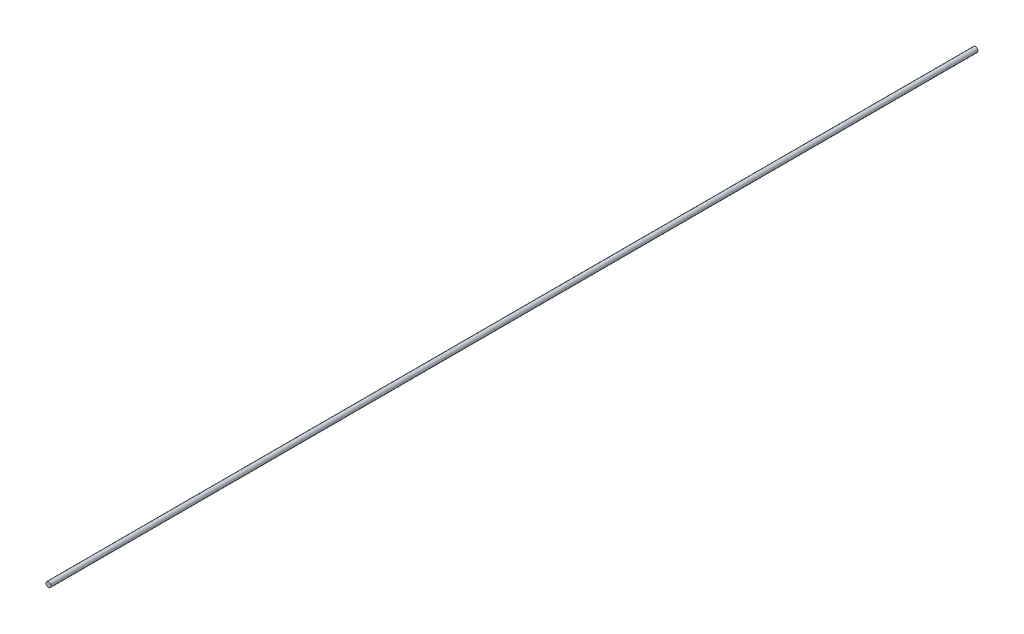
ISO-10303-21;
HEADER;
FILE_DESCRIPTION(('STEP AP214'),'2;1');
FILE_NAME('part.step','',(''),(''),'','','');
FILE_SCHEMA(('AUTOMOTIVE_DESIGN { 1 0 10303 214 1 1 1 1 }'));
ENDSEC;
DATA;
#1=APPLICATION_CONTEXT('core data for automotive mechanical design processes');
#2=APPLICATION_PROTOCOL_DEFINITION('international standard','automotive_design',2000,#1);
#3=PRODUCT_CONTEXT('',#1,'mechanical');
#4=PRODUCT('Part','Part','',(#3));
#5=PRODUCT_RELATED_PRODUCT_CATEGORY('part','',(#4));
#6=PRODUCT_DEFINITION_FORMATION('','',#4);
#7=PRODUCT_DEFINITION_CONTEXT('part definition',#1,'design');
#8=PRODUCT_DEFINITION('design','',#6,#7);
#9=PRODUCT_DEFINITION_SHAPE('','',#8);
#10=(LENGTH_UNIT() NAMED_UNIT(*) SI_UNIT(.MILLI.,.METRE.));
#11=(NAMED_UNIT(*) PLANE_ANGLE_UNIT() SI_UNIT($,.RADIAN.));
#12=(NAMED_UNIT(*) SI_UNIT($,.STERADIAN.) SOLID_ANGLE_UNIT());
#13=UNCERTAINTY_MEASURE_WITH_UNIT(LENGTH_MEASURE(1.E-05),#10,'distance_accuracy_value','');
#14=(GEOMETRIC_REPRESENTATION_CONTEXT(3) GLOBAL_UNCERTAINTY_ASSIGNED_CONTEXT((#13)) GLOBAL_UNIT_ASSIGNED_CONTEXT((#10,
#11,#12)) REPRESENTATION_CONTEXT('',''));
#15=CARTESIAN_POINT('',(0.,0.,0.));
#16=DIRECTION('',(0.,0.,1.));
#17=DIRECTION('',(1.,0.,0.));
#18=AXIS2_PLACEMENT_3D('',#15,#16,#17);
#19=CARTESIAN_POINT('',(0.,0.,4684.8900209175));
#20=DIRECTION('',(0.,0.,-1.));
#21=DIRECTION('',(-1.,0.,0.));
#22=AXIS2_PLACEMENT_3D('',#19,#20,#21);
#23=CYLINDRICAL_SURFACE('',#22,12.7);
#24=CARTESIAN_POINT('',(0.,0.,4684.8900209175));
#25=DIRECTION('',(0.,0.,1.));
#26=DIRECTION('',(1.,0.,0.));
#27=AXIS2_PLACEMENT_3D('',#24,#25,#26);
#28=CIRCLE('',#27,12.7);
#29=CARTESIAN_POINT('',(12.7,0.,4684.8900209175));
#30=VERTEX_POINT('',#29);
#31=EDGE_CURVE('E10',#30,#30,#28,.T.);
#32=ORIENTED_EDGE('',*,*,#31,.F.);
#33=EDGE_LOOP('',(#32));
#34=FACE_BOUND('',#33,.T.);
#35=CARTESIAN_POINT('',(0.,0.,0.));
#36=DIRECTION('',(0.,0.,1.));
#37=DIRECTION('',(1.,0.,0.));
#38=AXIS2_PLACEMENT_3D('',#35,#36,#37);
#39=CIRCLE('',#38,12.7);
#40=CARTESIAN_POINT('',(12.7,0.,0.));
#41=VERTEX_POINT('',#40);
#42=EDGE_CURVE('E45',#41,#41,#39,.T.);
#43=ORIENTED_EDGE('',*,*,#42,.T.);
#44=EDGE_LOOP('',(#43));
#45=FACE_BOUND('',#44,.T.);
#46=ADVANCED_FACE('F42',(#34,#45),#23,.T.);
#47=CARTESIAN_POINT('',(0.,0.,4684.8900209175));
#48=DIRECTION('',(0.,0.,1.));
#49=DIRECTION('',(1.,0.,0.));
#50=AXIS2_PLACEMENT_3D('',#47,#48,#49);
#51=PLANE('',#50);
#52=ORIENTED_EDGE('',*,*,#31,.T.);
#53=EDGE_LOOP('',(#52));
#54=FACE_BOUND('',#53,.T.);
#55=ADVANCED_FACE('F57',(#54),#51,.T.);
#56=CARTESIAN_POINT('',(0.,0.,0.));
#57=DIRECTION('',(0.,0.,1.));
#58=DIRECTION('',(1.,0.,0.));
#59=AXIS2_PLACEMENT_3D('',#56,#57,#58);
#60=PLANE('',#59);
#61=ORIENTED_EDGE('',*,*,#42,.F.);
#62=EDGE_LOOP('',(#61));
#63=FACE_BOUND('',#62,.T.);
#64=ADVANCED_FACE('F55',(#63),#60,.F.);
#65=CLOSED_SHELL('',(#46,#55,#64));
#66=MANIFOLD_SOLID_BREP('B2',#65);
#67=ADVANCED_BREP_SHAPE_REPRESENTATION('',(#18,#66),#14);
#68=SHAPE_DEFINITION_REPRESENTATION(#9,#67);
ENDSEC;
END-ISO-10303-21;
